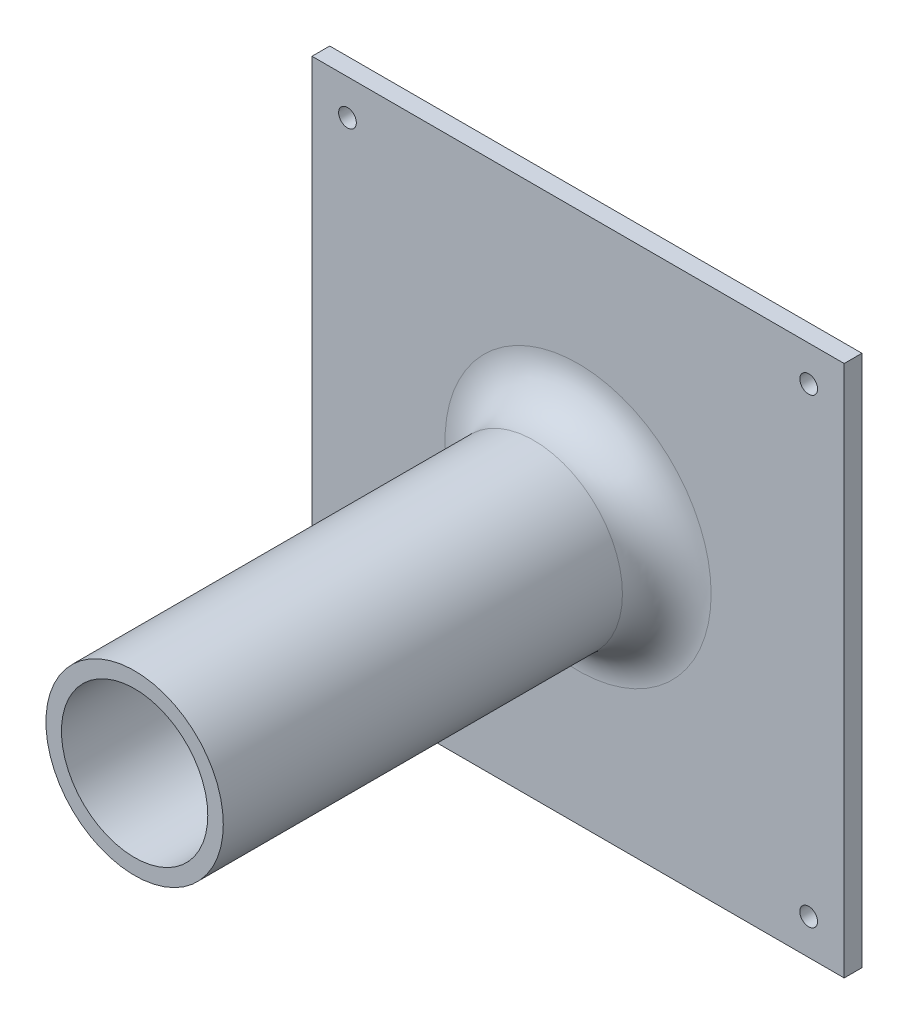
ISO-10303-21;
HEADER;
FILE_DESCRIPTION(('STEP AP214'),'2;1');
FILE_NAME('part.step','',(''),(''),'','','');
FILE_SCHEMA(('AUTOMOTIVE_DESIGN { 1 0 10303 214 1 1 1 1 }'));
ENDSEC;
DATA;
#1=APPLICATION_CONTEXT('core data for automotive mechanical design processes');
#2=APPLICATION_PROTOCOL_DEFINITION('international standard','automotive_design',2000,#1);
#3=PRODUCT_CONTEXT('',#1,'mechanical');
#4=PRODUCT('Part','Part','',(#3));
#5=PRODUCT_RELATED_PRODUCT_CATEGORY('part','',(#4));
#6=PRODUCT_DEFINITION_FORMATION('','',#4);
#7=PRODUCT_DEFINITION_CONTEXT('part definition',#1,'design');
#8=PRODUCT_DEFINITION('design','',#6,#7);
#9=PRODUCT_DEFINITION_SHAPE('','',#8);
#10=(LENGTH_UNIT() NAMED_UNIT(*) SI_UNIT(.MILLI.,.METRE.));
#11=(NAMED_UNIT(*) PLANE_ANGLE_UNIT() SI_UNIT($,.RADIAN.));
#12=(NAMED_UNIT(*) SI_UNIT($,.STERADIAN.) SOLID_ANGLE_UNIT());
#13=UNCERTAINTY_MEASURE_WITH_UNIT(LENGTH_MEASURE(1.E-05),#10,'distance_accuracy_value','');
#14=(GEOMETRIC_REPRESENTATION_CONTEXT(3) GLOBAL_UNCERTAINTY_ASSIGNED_CONTEXT((#13)) GLOBAL_UNIT_ASSIGNED_CONTEXT((#10,
#11,#12)) REPRESENTATION_CONTEXT('',''));
#15=CARTESIAN_POINT('',(0.,0.,0.));
#16=DIRECTION('',(0.,0.,1.));
#17=DIRECTION('',(1.,0.,0.));
#18=AXIS2_PLACEMENT_3D('',#15,#16,#17);
#19=CARTESIAN_POINT('',(0.,0.,2.));
#20=DIRECTION('',(0.,0.,1.));
#21=DIRECTION('',(1.,0.,0.));
#22=AXIS2_PLACEMENT_3D('',#19,#20,#21);
#23=PLANE('',#22);
#24=CARTESIAN_POINT('',(0.,0.,2.));
#25=DIRECTION('',(0.,0.,1.));
#26=DIRECTION('',(1.,0.,0.));
#27=AXIS2_PLACEMENT_3D('',#24,#25,#26);
#28=CIRCLE('',#27,15.);
#29=CARTESIAN_POINT('',(15.,0.,2.));
#30=VERTEX_POINT('',#29);
#31=EDGE_CURVE('E11',#30,#30,#28,.F.);
#32=ORIENTED_EDGE('',*,*,#31,.T.);
#33=EDGE_LOOP('',(#32));
#34=FACE_BOUND('',#33,.T.);
#35=CARTESIAN_POINT('',(26.,-26.,2.));
#36=DIRECTION('',(0.,0.,1.));
#37=DIRECTION('',(1.,0.,0.));
#38=AXIS2_PLACEMENT_3D('',#35,#36,#37);
#39=CIRCLE('',#38,1.);
#40=CARTESIAN_POINT('',(27.,-26.,2.));
#41=VERTEX_POINT('',#40);
#42=EDGE_CURVE('E181',#41,#41,#39,.T.);
#43=ORIENTED_EDGE('',*,*,#42,.F.);
#44=EDGE_LOOP('',(#43));
#45=FACE_BOUND('',#44,.T.);
#46=CARTESIAN_POINT('',(-26.,26.,2.));
#47=DIRECTION('',(0.,0.,1.));
#48=DIRECTION('',(1.,0.,0.));
#49=AXIS2_PLACEMENT_3D('',#46,#47,#48);
#50=CIRCLE('',#49,1.);
#51=CARTESIAN_POINT('',(-25.,26.,2.));
#52=VERTEX_POINT('',#51);
#53=EDGE_CURVE('E191',#52,#52,#50,.T.);
#54=ORIENTED_EDGE('',*,*,#53,.F.);
#55=EDGE_LOOP('',(#54));
#56=FACE_BOUND('',#55,.T.);
#57=DIRECTION('',(0.,-1.,0.));
#58=VECTOR('',#57,1.);
#59=CARTESIAN_POINT('',(-30.,30.,2.));
#60=LINE('',#59,#58);
#61=CARTESIAN_POINT('',(-30.,30.,2.));
#62=VERTEX_POINT('',#61);
#63=CARTESIAN_POINT('',(-30.,-30.,2.));
#64=VERTEX_POINT('',#63);
#65=EDGE_CURVE('E86',#62,#64,#60,.T.);
#66=ORIENTED_EDGE('',*,*,#65,.T.);
#67=DIRECTION('',(1.,0.,0.));
#68=VECTOR('',#67,1.);
#69=CARTESIAN_POINT('',(-30.,-30.,2.));
#70=LINE('',#69,#68);
#71=CARTESIAN_POINT('',(30.,-30.,2.));
#72=VERTEX_POINT('',#71);
#73=EDGE_CURVE('E81',#64,#72,#70,.T.);
#74=ORIENTED_EDGE('',*,*,#73,.T.);
#75=DIRECTION('',(0.,1.,0.));
#76=VECTOR('',#75,1.);
#77=CARTESIAN_POINT('',(30.,30.,2.));
#78=LINE('',#77,#76);
#79=CARTESIAN_POINT('',(30.,30.,2.));
#80=VERTEX_POINT('',#79);
#81=EDGE_CURVE('E84',#72,#80,#78,.T.);
#82=ORIENTED_EDGE('',*,*,#81,.T.);
#83=DIRECTION('',(-1.,0.,0.));
#84=VECTOR('',#83,1.);
#85=CARTESIAN_POINT('',(-30.,30.,2.));
#86=LINE('',#85,#84);
#87=EDGE_CURVE('E50',#80,#62,#86,.T.);
#88=ORIENTED_EDGE('',*,*,#87,.T.);
#89=EDGE_LOOP('',(#66,#74,#82,#88));
#90=FACE_BOUND('',#89,.T.);
#91=CARTESIAN_POINT('',(26.,26.,2.));
#92=DIRECTION('',(0.,0.,1.));
#93=DIRECTION('',(1.,0.,0.));
#94=AXIS2_PLACEMENT_3D('',#91,#92,#93);
#95=CIRCLE('',#94,1.);
#96=CARTESIAN_POINT('',(27.,26.,2.));
#97=VERTEX_POINT('',#96);
#98=EDGE_CURVE('E186',#97,#97,#95,.T.);
#99=ORIENTED_EDGE('',*,*,#98,.F.);
#100=EDGE_LOOP('',(#99));
#101=FACE_BOUND('',#100,.T.);
#102=CARTESIAN_POINT('',(-26.,-26.,2.));
#103=DIRECTION('',(0.,0.,1.));
#104=DIRECTION('',(1.,0.,0.));
#105=AXIS2_PLACEMENT_3D('',#102,#103,#104);
#106=CIRCLE('',#105,1.);
#107=CARTESIAN_POINT('',(-25.,-26.,2.));
#108=VERTEX_POINT('',#107);
#109=EDGE_CURVE('E171',#108,#108,#106,.T.);
#110=ORIENTED_EDGE('',*,*,#109,.F.);
#111=EDGE_LOOP('',(#110));
#112=FACE_BOUND('',#111,.T.);
#113=ADVANCED_FACE('F33',(#34,#45,#56,#90,#101,#112),#23,.T.);
#114=CARTESIAN_POINT('',(0.,0.,2.));
#115=DIRECTION('',(0.,0.,1.));
#116=DIRECTION('',(1.,0.,0.));
#117=AXIS2_PLACEMENT_3D('',#114,#115,#116);
#118=CIRCLE('',#117,8.25);
#119=CARTESIAN_POINT('',(8.25,0.,2.));
#120=VERTEX_POINT('',#119);
#121=EDGE_CURVE('E111',#120,#120,#118,.F.);
#122=ORIENTED_EDGE('',*,*,#121,.F.);
#123=EDGE_LOOP('',(#122));
#124=FACE_BOUND('',#123,.T.);
#125=CARTESIAN_POINT('',(0.,0.,2.));
#126=DIRECTION('',(0.,0.,1.));
#127=DIRECTION('',(1.,0.,0.));
#128=AXIS2_PLACEMENT_3D('',#125,#126,#127);
#129=CIRCLE('',#128,6.);
#130=CARTESIAN_POINT('',(6.,0.,2.));
#131=VERTEX_POINT('',#130);
#132=EDGE_CURVE('E104',#131,#131,#129,.T.);
#133=ORIENTED_EDGE('',*,*,#132,.F.);
#134=EDGE_LOOP('',(#133));
#135=FACE_BOUND('',#134,.T.);
#136=ADVANCED_FACE('F129',(#124,#135),#23,.T.);
#137=CARTESIAN_POINT('',(0.,0.,0.));
#138=DIRECTION('',(0.,0.,1.));
#139=DIRECTION('',(1.,0.,0.));
#140=AXIS2_PLACEMENT_3D('',#137,#138,#139);
#141=PLANE('',#140);
#142=CARTESIAN_POINT('',(26.,-26.,0.));
#143=DIRECTION('',(0.,0.,1.));
#144=DIRECTION('',(1.,0.,0.));
#145=AXIS2_PLACEMENT_3D('',#142,#143,#144);
#146=CIRCLE('',#145,1.);
#147=CARTESIAN_POINT('',(27.,-26.,0.));
#148=VERTEX_POINT('',#147);
#149=EDGE_CURVE('E175',#148,#148,#146,.T.);
#150=ORIENTED_EDGE('',*,*,#149,.T.);
#151=EDGE_LOOP('',(#150));
#152=FACE_BOUND('',#151,.T.);
#153=CARTESIAN_POINT('',(-26.,26.,0.));
#154=DIRECTION('',(0.,0.,1.));
#155=DIRECTION('',(1.,0.,0.));
#156=AXIS2_PLACEMENT_3D('',#153,#154,#155);
#157=CIRCLE('',#156,1.);
#158=CARTESIAN_POINT('',(-25.,26.,0.));
#159=VERTEX_POINT('',#158);
#160=EDGE_CURVE('E189',#159,#159,#157,.T.);
#161=ORIENTED_EDGE('',*,*,#160,.T.);
#162=EDGE_LOOP('',(#161));
#163=FACE_BOUND('',#162,.T.);
#164=DIRECTION('',(0.,-1.,0.));
#165=VECTOR('',#164,1.);
#166=CARTESIAN_POINT('',(-30.,30.,0.));
#167=LINE('',#166,#165);
#168=CARTESIAN_POINT('',(-30.,30.,0.));
#169=VERTEX_POINT('',#168);
#170=CARTESIAN_POINT('',(-30.,-30.,0.));
#171=VERTEX_POINT('',#170);
#172=EDGE_CURVE('E101',#169,#171,#167,.T.);
#173=ORIENTED_EDGE('',*,*,#172,.F.);
#174=DIRECTION('',(-1.,0.,0.));
#175=VECTOR('',#174,1.);
#176=CARTESIAN_POINT('',(-30.,30.,0.));
#177=LINE('',#176,#175);
#178=CARTESIAN_POINT('',(30.,30.,0.));
#179=VERTEX_POINT('',#178);
#180=EDGE_CURVE('E73',#179,#169,#177,.T.);
#181=ORIENTED_EDGE('',*,*,#180,.F.);
#182=DIRECTION('',(0.,1.,0.));
#183=VECTOR('',#182,1.);
#184=CARTESIAN_POINT('',(30.,30.,0.));
#185=LINE('',#184,#183);
#186=CARTESIAN_POINT('',(30.,-30.,0.));
#187=VERTEX_POINT('',#186);
#188=EDGE_CURVE('E67',#187,#179,#185,.T.);
#189=ORIENTED_EDGE('',*,*,#188,.F.);
#190=DIRECTION('',(1.,0.,0.));
#191=VECTOR('',#190,1.);
#192=CARTESIAN_POINT('',(-30.,-30.,0.));
#193=LINE('',#192,#191);
#194=EDGE_CURVE('E91',#171,#187,#193,.T.);
#195=ORIENTED_EDGE('',*,*,#194,.F.);
#196=EDGE_LOOP('',(#173,#181,#189,#195));
#197=FACE_BOUND('',#196,.T.);
#198=CARTESIAN_POINT('',(0.,0.,0.));
#199=DIRECTION('',(0.,0.,1.));
#200=DIRECTION('',(1.,0.,0.));
#201=AXIS2_PLACEMENT_3D('',#198,#199,#200);
#202=CIRCLE('',#201,6.);
#203=CARTESIAN_POINT('',(6.,0.,0.));
#204=VERTEX_POINT('',#203);
#205=EDGE_CURVE('E162',#204,#204,#202,.T.);
#206=ORIENTED_EDGE('',*,*,#205,.T.);
#207=EDGE_LOOP('',(#206));
#208=FACE_BOUND('',#207,.T.);
#209=CARTESIAN_POINT('',(26.,26.,0.));
#210=DIRECTION('',(0.,0.,1.));
#211=DIRECTION('',(1.,0.,0.));
#212=AXIS2_PLACEMENT_3D('',#209,#210,#211);
#213=CIRCLE('',#212,1.);
#214=CARTESIAN_POINT('',(27.,26.,0.));
#215=VERTEX_POINT('',#214);
#216=EDGE_CURVE('E166',#215,#215,#213,.T.);
#217=ORIENTED_EDGE('',*,*,#216,.T.);
#218=EDGE_LOOP('',(#217));
#219=FACE_BOUND('',#218,.T.);
#220=CARTESIAN_POINT('',(-26.,-26.,0.));
#221=DIRECTION('',(0.,0.,1.));
#222=DIRECTION('',(1.,0.,0.));
#223=AXIS2_PLACEMENT_3D('',#220,#221,#222);
#224=CIRCLE('',#223,1.);
#225=CARTESIAN_POINT('',(-25.,-26.,0.));
#226=VERTEX_POINT('',#225);
#227=EDGE_CURVE('E169',#226,#226,#224,.T.);
#228=ORIENTED_EDGE('',*,*,#227,.T.);
#229=EDGE_LOOP('',(#228));
#230=FACE_BOUND('',#229,.T.);
#231=ADVANCED_FACE('F135',(#152,#163,#197,#208,#219,#230),#141,.F.);
#232=CARTESIAN_POINT('',(-30.,30.,2.));
#233=DIRECTION('',(1.,0.,0.));
#234=DIRECTION('',(0.,1.,0.));
#235=AXIS2_PLACEMENT_3D('',#232,#233,#234);
#236=PLANE('',#235);
#237=ORIENTED_EDGE('',*,*,#172,.T.);
#238=DIRECTION('',(0.,0.,-1.));
#239=VECTOR('',#238,1.);
#240=CARTESIAN_POINT('',(-30.,-30.,2.));
#241=LINE('',#240,#239);
#242=EDGE_CURVE('E92',#64,#171,#241,.T.);
#243=ORIENTED_EDGE('',*,*,#242,.F.);
#244=ORIENTED_EDGE('',*,*,#65,.F.);
#245=DIRECTION('',(0.,0.,-1.));
#246=VECTOR('',#245,1.);
#247=CARTESIAN_POINT('',(-30.,30.,2.));
#248=LINE('',#247,#246);
#249=EDGE_CURVE('E97',#62,#169,#248,.T.);
#250=ORIENTED_EDGE('',*,*,#249,.T.);
#251=EDGE_LOOP('',(#237,#243,#244,#250));
#252=FACE_BOUND('',#251,.T.);
#253=ADVANCED_FACE('F144',(#252),#236,.F.);
#254=CARTESIAN_POINT('',(-30.,-30.,2.));
#255=DIRECTION('',(0.,1.,0.));
#256=DIRECTION('',(-1.,0.,0.));
#257=AXIS2_PLACEMENT_3D('',#254,#255,#256);
#258=PLANE('',#257);
#259=ORIENTED_EDGE('',*,*,#194,.T.);
#260=DIRECTION('',(0.,0.,-1.));
#261=VECTOR('',#260,1.);
#262=CARTESIAN_POINT('',(30.,-30.,2.));
#263=LINE('',#262,#261);
#264=EDGE_CURVE('E89',#72,#187,#263,.T.);
#265=ORIENTED_EDGE('',*,*,#264,.F.);
#266=ORIENTED_EDGE('',*,*,#73,.F.);
#267=ORIENTED_EDGE('',*,*,#242,.T.);
#268=EDGE_LOOP('',(#259,#265,#266,#267));
#269=FACE_BOUND('',#268,.T.);
#270=ADVANCED_FACE('F90',(#269),#258,.F.);
#271=CARTESIAN_POINT('',(30.,30.,2.));
#272=DIRECTION('',(-1.,0.,0.));
#273=DIRECTION('',(0.,0.,1.));
#274=AXIS2_PLACEMENT_3D('',#271,#272,#273);
#275=PLANE('',#274);
#276=ORIENTED_EDGE('',*,*,#188,.T.);
#277=DIRECTION('',(0.,0.,-1.));
#278=VECTOR('',#277,1.);
#279=CARTESIAN_POINT('',(30.,30.,2.));
#280=LINE('',#279,#278);
#281=EDGE_CURVE('E93',#80,#179,#280,.T.);
#282=ORIENTED_EDGE('',*,*,#281,.F.);
#283=ORIENTED_EDGE('',*,*,#81,.F.);
#284=ORIENTED_EDGE('',*,*,#264,.T.);
#285=EDGE_LOOP('',(#276,#282,#283,#284));
#286=FACE_BOUND('',#285,.T.);
#287=ADVANCED_FACE('F95',(#286),#275,.F.);
#288=CARTESIAN_POINT('',(-30.,30.,2.));
#289=DIRECTION('',(0.,-1.,0.));
#290=DIRECTION('',(1.,0.,0.));
#291=AXIS2_PLACEMENT_3D('',#288,#289,#290);
#292=PLANE('',#291);
#293=ORIENTED_EDGE('',*,*,#180,.T.);
#294=ORIENTED_EDGE('',*,*,#249,.F.);
#295=ORIENTED_EDGE('',*,*,#87,.F.);
#296=ORIENTED_EDGE('',*,*,#281,.T.);
#297=EDGE_LOOP('',(#293,#294,#295,#296));
#298=FACE_BOUND('',#297,.T.);
#299=ADVANCED_FACE('F146',(#298),#292,.F.);
#300=CARTESIAN_POINT('',(0.,0.,2.));
#301=DIRECTION('',(0.,0.,-1.));
#302=DIRECTION('',(-1.,0.,0.));
#303=AXIS2_PLACEMENT_3D('',#300,#301,#302);
#304=CYLINDRICAL_SURFACE('',#303,6.);
#305=ORIENTED_EDGE('',*,*,#132,.T.);
#306=EDGE_LOOP('',(#305));
#307=FACE_BOUND('',#306,.T.);
#308=ORIENTED_EDGE('',*,*,#205,.F.);
#309=EDGE_LOOP('',(#308));
#310=FACE_BOUND('',#309,.T.);
#311=ADVANCED_FACE('F140',(#307,#310),#304,.F.);
#312=CARTESIAN_POINT('',(-26.,26.,2.));
#313=DIRECTION('',(0.,0.,-1.));
#314=DIRECTION('',(-1.,0.,0.));
#315=AXIS2_PLACEMENT_3D('',#312,#313,#314);
#316=CYLINDRICAL_SURFACE('',#315,1.);
#317=ORIENTED_EDGE('',*,*,#53,.T.);
#318=EDGE_LOOP('',(#317));
#319=FACE_BOUND('',#318,.T.);
#320=ORIENTED_EDGE('',*,*,#160,.F.);
#321=EDGE_LOOP('',(#320));
#322=FACE_BOUND('',#321,.T.);
#323=ADVANCED_FACE('F203',(#319,#322),#316,.F.);
#324=CARTESIAN_POINT('',(26.,26.,2.));
#325=DIRECTION('',(0.,0.,-1.));
#326=DIRECTION('',(-1.,0.,0.));
#327=AXIS2_PLACEMENT_3D('',#324,#325,#326);
#328=CYLINDRICAL_SURFACE('',#327,1.);
#329=ORIENTED_EDGE('',*,*,#98,.T.);
#330=EDGE_LOOP('',(#329));
#331=FACE_BOUND('',#330,.T.);
#332=ORIENTED_EDGE('',*,*,#216,.F.);
#333=EDGE_LOOP('',(#332));
#334=FACE_BOUND('',#333,.T.);
#335=ADVANCED_FACE('F207',(#331,#334),#328,.F.);
#336=CARTESIAN_POINT('',(26.,-26.,2.));
#337=DIRECTION('',(0.,0.,-1.));
#338=DIRECTION('',(-1.,0.,0.));
#339=AXIS2_PLACEMENT_3D('',#336,#337,#338);
#340=CYLINDRICAL_SURFACE('',#339,1.);
#341=ORIENTED_EDGE('',*,*,#42,.T.);
#342=EDGE_LOOP('',(#341));
#343=FACE_BOUND('',#342,.T.);
#344=ORIENTED_EDGE('',*,*,#149,.F.);
#345=EDGE_LOOP('',(#344));
#346=FACE_BOUND('',#345,.T.);
#347=ADVANCED_FACE('F212',(#343,#346),#340,.F.);
#348=CARTESIAN_POINT('',(-26.,-26.,2.));
#349=DIRECTION('',(0.,0.,-1.));
#350=DIRECTION('',(-1.,0.,0.));
#351=AXIS2_PLACEMENT_3D('',#348,#349,#350);
#352=CYLINDRICAL_SURFACE('',#351,1.);
#353=ORIENTED_EDGE('',*,*,#109,.T.);
#354=EDGE_LOOP('',(#353));
#355=FACE_BOUND('',#354,.T.);
#356=ORIENTED_EDGE('',*,*,#227,.F.);
#357=EDGE_LOOP('',(#356));
#358=FACE_BOUND('',#357,.T.);
#359=ADVANCED_FACE('F219',(#355,#358),#352,.F.);
#360=CARTESIAN_POINT('',(0.,0.,52.));
#361=DIRECTION('',(0.,0.,1.));
#362=DIRECTION('',(1.,0.,0.));
#363=AXIS2_PLACEMENT_3D('',#360,#361,#362);
#364=PLANE('',#363);
#365=CARTESIAN_POINT('',(0.,0.,52.));
#366=DIRECTION('',(0.,0.,1.));
#367=DIRECTION('',(1.,0.,0.));
#368=AXIS2_PLACEMENT_3D('',#365,#366,#367);
#369=CIRCLE('',#368,10.);
#370=CARTESIAN_POINT('',(10.,0.,52.));
#371=VERTEX_POINT('',#370);
#372=EDGE_CURVE('E172',#371,#371,#369,.T.);
#373=ORIENTED_EDGE('',*,*,#372,.T.);
#374=EDGE_LOOP('',(#373));
#375=FACE_BOUND('',#374,.T.);
#376=CARTESIAN_POINT('',(0.,0.,52.));
#377=DIRECTION('',(0.,0.,1.));
#378=DIRECTION('',(1.,0.,0.));
#379=AXIS2_PLACEMENT_3D('',#376,#377,#378);
#380=CIRCLE('',#379,8.25);
#381=CARTESIAN_POINT('',(8.25,0.,52.));
#382=VERTEX_POINT('',#381);
#383=EDGE_CURVE('E178',#382,#382,#380,.T.);
#384=ORIENTED_EDGE('',*,*,#383,.F.);
#385=EDGE_LOOP('',(#384));
#386=FACE_BOUND('',#385,.T.);
#387=ADVANCED_FACE('F223',(#375,#386),#364,.T.);
#388=CARTESIAN_POINT('',(0.,0.,52.));
#389=DIRECTION('',(0.,0.,-1.));
#390=DIRECTION('',(-1.,0.,0.));
#391=AXIS2_PLACEMENT_3D('',#388,#389,#390);
#392=CYLINDRICAL_SURFACE('',#391,10.);
#393=CARTESIAN_POINT('',(0.,0.,7.));
#394=DIRECTION('',(0.,0.,1.));
#395=DIRECTION('',(1.,0.,0.));
#396=AXIS2_PLACEMENT_3D('',#393,#394,#395);
#397=CIRCLE('',#396,10.);
#398=CARTESIAN_POINT('',(10.,0.,7.));
#399=VERTEX_POINT('',#398);
#400=EDGE_CURVE('E42',#399,#399,#397,.T.);
#401=ORIENTED_EDGE('',*,*,#400,.T.);
#402=EDGE_LOOP('',(#401));
#403=FACE_BOUND('',#402,.T.);
#404=ORIENTED_EDGE('',*,*,#372,.F.);
#405=EDGE_LOOP('',(#404));
#406=FACE_BOUND('',#405,.T.);
#407=ADVANCED_FACE('F116',(#403,#406),#392,.T.);
#408=CARTESIAN_POINT('',(0.,0.,52.));
#409=DIRECTION('',(0.,0.,-1.));
#410=DIRECTION('',(-1.,0.,0.));
#411=AXIS2_PLACEMENT_3D('',#408,#409,#410);
#412=CYLINDRICAL_SURFACE('',#411,8.25);
#413=ORIENTED_EDGE('',*,*,#383,.T.);
#414=EDGE_LOOP('',(#413));
#415=FACE_BOUND('',#414,.T.);
#416=ORIENTED_EDGE('',*,*,#121,.T.);
#417=EDGE_LOOP('',(#416));
#418=FACE_BOUND('',#417,.T.);
#419=ADVANCED_FACE('F120',(#415,#418),#412,.F.);
#420=CARTESIAN_POINT('',(0.,0.,7.));
#421=DIRECTION('',(0.,0.,1.));
#422=DIRECTION('',(1.,0.,0.));
#423=AXIS2_PLACEMENT_3D('',#420,#421,#422);
#424=TOROIDAL_SURFACE('',#423,15.,5.);
#425=ORIENTED_EDGE('',*,*,#31,.F.);
#426=EDGE_LOOP('',(#425));
#427=FACE_BOUND('',#426,.T.);
#428=ORIENTED_EDGE('',*,*,#400,.F.);
#429=EDGE_LOOP('',(#428));
#430=FACE_BOUND('',#429,.T.);
#431=ADVANCED_FACE('F35',(#427,#430),#424,.F.);
#432=CLOSED_SHELL('',(#113,#136,#231,#253,#270,#287,#299,#311,#323,#335,#347,#359,#387,#407,
#419,#431));
#433=MANIFOLD_SOLID_BREP('B2',#432);
#434=ADVANCED_BREP_SHAPE_REPRESENTATION('',(#18,#433),#14);
#435=SHAPE_DEFINITION_REPRESENTATION(#9,#434);
ENDSEC;
END-ISO-10303-21;
